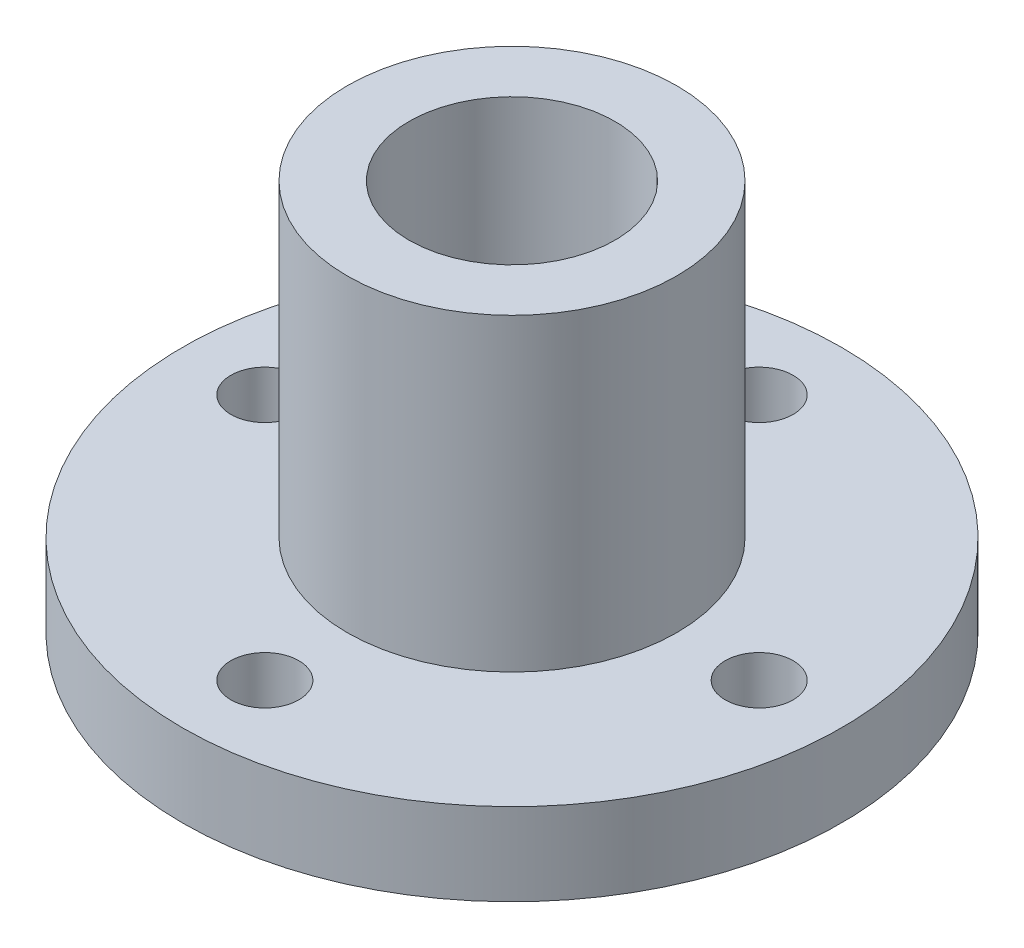
ISO-10303-21;
HEADER;
FILE_DESCRIPTION(('STEP AP214'),'2;1');
FILE_NAME('part.step','',(''),(''),'','','');
FILE_SCHEMA(('AUTOMOTIVE_DESIGN { 1 0 10303 214 1 1 1 1 }'));
ENDSEC;
DATA;
#1=APPLICATION_CONTEXT('core data for automotive mechanical design processes');
#2=APPLICATION_PROTOCOL_DEFINITION('international standard','automotive_design',2000,#1);
#3=PRODUCT_CONTEXT('',#1,'mechanical');
#4=PRODUCT('Part','Part','',(#3));
#5=PRODUCT_RELATED_PRODUCT_CATEGORY('part','',(#4));
#6=PRODUCT_DEFINITION_FORMATION('','',#4);
#7=PRODUCT_DEFINITION_CONTEXT('part definition',#1,'design');
#8=PRODUCT_DEFINITION('design','',#6,#7);
#9=PRODUCT_DEFINITION_SHAPE('','',#8);
#10=(LENGTH_UNIT() NAMED_UNIT(*) SI_UNIT(.MILLI.,.METRE.));
#11=(NAMED_UNIT(*) PLANE_ANGLE_UNIT() SI_UNIT($,.RADIAN.));
#12=(NAMED_UNIT(*) SI_UNIT($,.STERADIAN.) SOLID_ANGLE_UNIT());
#13=UNCERTAINTY_MEASURE_WITH_UNIT(LENGTH_MEASURE(1.E-05),#10,'distance_accuracy_value','');
#14=(GEOMETRIC_REPRESENTATION_CONTEXT(3) GLOBAL_UNCERTAINTY_ASSIGNED_CONTEXT((#13)) GLOBAL_UNIT_ASSIGNED_CONTEXT((#10,
#11,#12)) REPRESENTATION_CONTEXT('',''));
#15=CARTESIAN_POINT('',(0.,0.,0.));
#16=DIRECTION('',(0.,0.,1.));
#17=DIRECTION('',(1.,0.,0.));
#18=AXIS2_PLACEMENT_3D('',#15,#16,#17);
#19=CARTESIAN_POINT('',(0.,19.,0.));
#20=DIRECTION('',(0.,-1.,0.));
#21=DIRECTION('',(0.,0.,-1.));
#22=AXIS2_PLACEMENT_3D('',#19,#20,#21);
#23=CYLINDRICAL_SURFACE('',#22,8.);
#24=CARTESIAN_POINT('',(0.,19.,0.));
#25=DIRECTION('',(0.,1.,0.));
#26=DIRECTION('',(0.,0.,1.));
#27=AXIS2_PLACEMENT_3D('',#24,#25,#26);
#28=CIRCLE('',#27,8.);
#29=CARTESIAN_POINT('',(0.,19.,8.));
#30=VERTEX_POINT('',#29);
#31=EDGE_CURVE('E37',#30,#30,#28,.T.);
#32=ORIENTED_EDGE('',*,*,#31,.F.);
#33=EDGE_LOOP('',(#32));
#34=FACE_BOUND('',#33,.T.);
#35=CARTESIAN_POINT('',(0.,4.,0.));
#36=DIRECTION('',(0.,-1.,0.));
#37=DIRECTION('',(0.,0.,-1.));
#38=AXIS2_PLACEMENT_3D('',#35,#36,#37);
#39=CIRCLE('',#38,8.);
#40=CARTESIAN_POINT('',(0.,4.,-8.));
#41=VERTEX_POINT('',#40);
#42=EDGE_CURVE('E10',#41,#41,#39,.T.);
#43=ORIENTED_EDGE('',*,*,#42,.F.);
#44=EDGE_LOOP('',(#43));
#45=FACE_BOUND('',#44,.T.);
#46=ADVANCED_FACE('F34',(#34,#45),#23,.T.);
#47=CARTESIAN_POINT('',(0.,19.,0.));
#48=DIRECTION('',(0.,-1.,0.));
#49=DIRECTION('',(0.,0.,-1.));
#50=AXIS2_PLACEMENT_3D('',#47,#48,#49);
#51=CYLINDRICAL_SURFACE('',#50,5.);
#52=CARTESIAN_POINT('',(0.,19.,0.));
#53=DIRECTION('',(0.,1.,0.));
#54=DIRECTION('',(0.,0.,1.));
#55=AXIS2_PLACEMENT_3D('',#52,#53,#54);
#56=CIRCLE('',#55,5.);
#57=CARTESIAN_POINT('',(0.,19.,5.));
#58=VERTEX_POINT('',#57);
#59=EDGE_CURVE('E45',#58,#58,#56,.T.);
#60=ORIENTED_EDGE('',*,*,#59,.T.);
#61=EDGE_LOOP('',(#60));
#62=FACE_BOUND('',#61,.T.);
#63=CARTESIAN_POINT('',(0.,0.,0.));
#64=DIRECTION('',(0.,1.,0.));
#65=DIRECTION('',(0.,0.,1.));
#66=AXIS2_PLACEMENT_3D('',#63,#64,#65);
#67=CIRCLE('',#66,5.);
#68=CARTESIAN_POINT('',(0.,0.,5.));
#69=VERTEX_POINT('',#68);
#70=EDGE_CURVE('E80',#69,#69,#67,.T.);
#71=ORIENTED_EDGE('',*,*,#70,.F.);
#72=EDGE_LOOP('',(#71));
#73=FACE_BOUND('',#72,.T.);
#74=ADVANCED_FACE('F89',(#62,#73),#51,.F.);
#75=CARTESIAN_POINT('',(0.,19.,0.));
#76=DIRECTION('',(0.,1.,0.));
#77=DIRECTION('',(0.,0.,1.));
#78=AXIS2_PLACEMENT_3D('',#75,#76,#77);
#79=PLANE('',#78);
#80=ORIENTED_EDGE('',*,*,#31,.T.);
#81=EDGE_LOOP('',(#80));
#82=FACE_BOUND('',#81,.T.);
#83=ORIENTED_EDGE('',*,*,#59,.F.);
#84=EDGE_LOOP('',(#83));
#85=FACE_BOUND('',#84,.T.);
#86=ADVANCED_FACE('F91',(#82,#85),#79,.T.);
#87=CARTESIAN_POINT('',(0.,4.,0.));
#88=DIRECTION('',(0.,-1.,0.));
#89=DIRECTION('',(0.,0.,-1.));
#90=AXIS2_PLACEMENT_3D('',#87,#88,#89);
#91=CYLINDRICAL_SURFACE('',#90,16.);
#92=CARTESIAN_POINT('',(0.,4.,0.));
#93=DIRECTION('',(0.,-1.,0.));
#94=DIRECTION('',(0.,0.,-1.));
#95=AXIS2_PLACEMENT_3D('',#92,#93,#94);
#96=CIRCLE('',#95,16.);
#97=CARTESIAN_POINT('',(0.,4.,-16.));
#98=VERTEX_POINT('',#97);
#99=EDGE_CURVE('E50',#98,#98,#96,.T.);
#100=ORIENTED_EDGE('',*,*,#99,.T.);
#101=EDGE_LOOP('',(#100));
#102=FACE_BOUND('',#101,.T.);
#103=CARTESIAN_POINT('',(0.,0.,0.));
#104=DIRECTION('',(0.,-1.,0.));
#105=DIRECTION('',(0.,0.,-1.));
#106=AXIS2_PLACEMENT_3D('',#103,#104,#105);
#107=CIRCLE('',#106,16.);
#108=CARTESIAN_POINT('',(0.,0.,-16.));
#109=VERTEX_POINT('',#108);
#110=EDGE_CURVE('E47',#109,#109,#107,.T.);
#111=ORIENTED_EDGE('',*,*,#110,.F.);
#112=EDGE_LOOP('',(#111));
#113=FACE_BOUND('',#112,.T.);
#114=ADVANCED_FACE('F97',(#102,#113),#91,.T.);
#115=CARTESIAN_POINT('',(0.,4.,0.));
#116=DIRECTION('',(0.,-1.,0.));
#117=DIRECTION('',(0.,0.,-1.));
#118=AXIS2_PLACEMENT_3D('',#115,#116,#117);
#119=PLANE('',#118);
#120=ORIENTED_EDGE('',*,*,#42,.T.);
#121=EDGE_LOOP('',(#120));
#122=FACE_BOUND('',#121,.T.);
#123=CARTESIAN_POINT('',(0.,4.,-12.));
#124=DIRECTION('',(0.,-1.,0.));
#125=DIRECTION('',(0.,0.,-1.));
#126=AXIS2_PLACEMENT_3D('',#123,#124,#125);
#127=CIRCLE('',#126,1.65);
#128=CARTESIAN_POINT('',(0.,4.,-13.65));
#129=VERTEX_POINT('',#128);
#130=EDGE_CURVE('E74',#129,#129,#127,.T.);
#131=ORIENTED_EDGE('',*,*,#130,.T.);
#132=EDGE_LOOP('',(#131));
#133=FACE_BOUND('',#132,.T.);
#134=CARTESIAN_POINT('',(12.,4.,0.));
#135=DIRECTION('',(0.,-1.,0.));
#136=DIRECTION('',(0.,0.,-1.));
#137=AXIS2_PLACEMENT_3D('',#134,#135,#136);
#138=CIRCLE('',#137,1.65);
#139=CARTESIAN_POINT('',(12.,4.,-1.65));
#140=VERTEX_POINT('',#139);
#141=EDGE_CURVE('E68',#140,#140,#138,.T.);
#142=ORIENTED_EDGE('',*,*,#141,.T.);
#143=EDGE_LOOP('',(#142));
#144=FACE_BOUND('',#143,.T.);
#145=CARTESIAN_POINT('',(0.,4.,12.));
#146=DIRECTION('',(0.,-1.,0.));
#147=DIRECTION('',(0.,0.,-1.));
#148=AXIS2_PLACEMENT_3D('',#145,#146,#147);
#149=CIRCLE('',#148,1.65);
#150=CARTESIAN_POINT('',(0.,4.,10.35));
#151=VERTEX_POINT('',#150);
#152=EDGE_CURVE('E62',#151,#151,#149,.T.);
#153=ORIENTED_EDGE('',*,*,#152,.T.);
#154=EDGE_LOOP('',(#153));
#155=FACE_BOUND('',#154,.T.);
#156=CARTESIAN_POINT('',(-12.,4.,0.));
#157=DIRECTION('',(0.,-1.,0.));
#158=DIRECTION('',(0.,0.,-1.));
#159=AXIS2_PLACEMENT_3D('',#156,#157,#158);
#160=CIRCLE('',#159,1.65);
#161=CARTESIAN_POINT('',(-12.,4.,-1.65));
#162=VERTEX_POINT('',#161);
#163=EDGE_CURVE('E57',#162,#162,#160,.T.);
#164=ORIENTED_EDGE('',*,*,#163,.T.);
#165=EDGE_LOOP('',(#164));
#166=FACE_BOUND('',#165,.T.);
#167=ORIENTED_EDGE('',*,*,#99,.F.);
#168=EDGE_LOOP('',(#167));
#169=FACE_BOUND('',#168,.T.);
#170=ADVANCED_FACE('F125',(#122,#133,#144,#155,#166,#169),#119,.F.);
#171=CARTESIAN_POINT('',(-12.,4.,0.));
#172=DIRECTION('',(0.,-1.,0.));
#173=DIRECTION('',(0.,0.,-1.));
#174=AXIS2_PLACEMENT_3D('',#171,#172,#173);
#175=CYLINDRICAL_SURFACE('',#174,1.65);
#176=ORIENTED_EDGE('',*,*,#163,.F.);
#177=EDGE_LOOP('',(#176));
#178=FACE_BOUND('',#177,.T.);
#179=CARTESIAN_POINT('',(-12.,0.,0.));
#180=DIRECTION('',(0.,-1.,0.));
#181=DIRECTION('',(0.,0.,-1.));
#182=AXIS2_PLACEMENT_3D('',#179,#180,#181);
#183=CIRCLE('',#182,1.65);
#184=CARTESIAN_POINT('',(-12.,0.,-1.65));
#185=VERTEX_POINT('',#184);
#186=EDGE_CURVE('E59',#185,#185,#183,.T.);
#187=ORIENTED_EDGE('',*,*,#186,.T.);
#188=EDGE_LOOP('',(#187));
#189=FACE_BOUND('',#188,.T.);
#190=ADVANCED_FACE('F122',(#178,#189),#175,.F.);
#191=CARTESIAN_POINT('',(0.,4.,12.));
#192=DIRECTION('',(0.,-1.,0.));
#193=DIRECTION('',(0.,0.,-1.));
#194=AXIS2_PLACEMENT_3D('',#191,#192,#193);
#195=CYLINDRICAL_SURFACE('',#194,1.65);
#196=ORIENTED_EDGE('',*,*,#152,.F.);
#197=EDGE_LOOP('',(#196));
#198=FACE_BOUND('',#197,.T.);
#199=CARTESIAN_POINT('',(0.,0.,12.));
#200=DIRECTION('',(0.,-1.,0.));
#201=DIRECTION('',(0.,0.,-1.));
#202=AXIS2_PLACEMENT_3D('',#199,#200,#201);
#203=CIRCLE('',#202,1.65);
#204=CARTESIAN_POINT('',(0.,0.,10.35));
#205=VERTEX_POINT('',#204);
#206=EDGE_CURVE('E65',#205,#205,#203,.T.);
#207=ORIENTED_EDGE('',*,*,#206,.T.);
#208=EDGE_LOOP('',(#207));
#209=FACE_BOUND('',#208,.T.);
#210=ADVANCED_FACE('F114',(#198,#209),#195,.F.);
#211=CARTESIAN_POINT('',(12.,4.,0.));
#212=DIRECTION('',(0.,-1.,0.));
#213=DIRECTION('',(0.,0.,-1.));
#214=AXIS2_PLACEMENT_3D('',#211,#212,#213);
#215=CYLINDRICAL_SURFACE('',#214,1.65);
#216=ORIENTED_EDGE('',*,*,#141,.F.);
#217=EDGE_LOOP('',(#216));
#218=FACE_BOUND('',#217,.T.);
#219=CARTESIAN_POINT('',(12.,0.,0.));
#220=DIRECTION('',(0.,-1.,0.));
#221=DIRECTION('',(0.,0.,-1.));
#222=AXIS2_PLACEMENT_3D('',#219,#220,#221);
#223=CIRCLE('',#222,1.65);
#224=CARTESIAN_POINT('',(12.,0.,-1.65));
#225=VERTEX_POINT('',#224);
#226=EDGE_CURVE('E71',#225,#225,#223,.T.);
#227=ORIENTED_EDGE('',*,*,#226,.T.);
#228=EDGE_LOOP('',(#227));
#229=FACE_BOUND('',#228,.T.);
#230=ADVANCED_FACE('F108',(#218,#229),#215,.F.);
#231=CARTESIAN_POINT('',(0.,4.,-12.));
#232=DIRECTION('',(0.,-1.,0.));
#233=DIRECTION('',(0.,0.,-1.));
#234=AXIS2_PLACEMENT_3D('',#231,#232,#233);
#235=CYLINDRICAL_SURFACE('',#234,1.65);
#236=ORIENTED_EDGE('',*,*,#130,.F.);
#237=EDGE_LOOP('',(#236));
#238=FACE_BOUND('',#237,.T.);
#239=CARTESIAN_POINT('',(0.,0.,-12.));
#240=DIRECTION('',(0.,-1.,0.));
#241=DIRECTION('',(0.,0.,-1.));
#242=AXIS2_PLACEMENT_3D('',#239,#240,#241);
#243=CIRCLE('',#242,1.65);
#244=CARTESIAN_POINT('',(0.,0.,-13.65));
#245=VERTEX_POINT('',#244);
#246=EDGE_CURVE('E77',#245,#245,#243,.T.);
#247=ORIENTED_EDGE('',*,*,#246,.T.);
#248=EDGE_LOOP('',(#247));
#249=FACE_BOUND('',#248,.T.);
#250=ADVANCED_FACE('F104',(#238,#249),#235,.F.);
#251=CARTESIAN_POINT('',(0.,0.,0.));
#252=DIRECTION('',(0.,1.,0.));
#253=DIRECTION('',(0.,0.,1.));
#254=AXIS2_PLACEMENT_3D('',#251,#252,#253);
#255=PLANE('',#254);
#256=ORIENTED_EDGE('',*,*,#70,.T.);
#257=EDGE_LOOP('',(#256));
#258=FACE_BOUND('',#257,.T.);
#259=ORIENTED_EDGE('',*,*,#246,.F.);
#260=EDGE_LOOP('',(#259));
#261=FACE_BOUND('',#260,.T.);
#262=ORIENTED_EDGE('',*,*,#226,.F.);
#263=EDGE_LOOP('',(#262));
#264=FACE_BOUND('',#263,.T.);
#265=ORIENTED_EDGE('',*,*,#206,.F.);
#266=EDGE_LOOP('',(#265));
#267=FACE_BOUND('',#266,.T.);
#268=ORIENTED_EDGE('',*,*,#186,.F.);
#269=EDGE_LOOP('',(#268));
#270=FACE_BOUND('',#269,.T.);
#271=ORIENTED_EDGE('',*,*,#110,.T.);
#272=EDGE_LOOP('',(#271));
#273=FACE_BOUND('',#272,.T.);
#274=ADVANCED_FACE('F86',(#258,#261,#264,#267,#270,#273),#255,.F.);
#275=CLOSED_SHELL('',(#46,#74,#86,#114,#170,#190,#210,#230,#250,#274));
#276=MANIFOLD_SOLID_BREP('B2',#275);
#277=ADVANCED_BREP_SHAPE_REPRESENTATION('',(#18,#276),#14);
#278=SHAPE_DEFINITION_REPRESENTATION(#9,#277);
ENDSEC;
END-ISO-10303-21;
